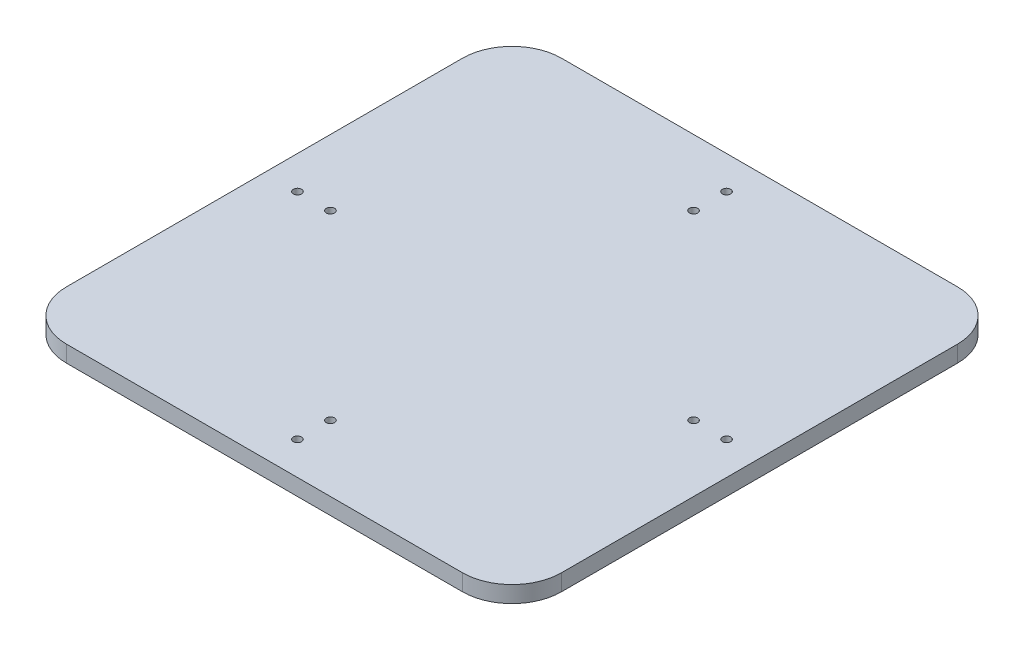
ISO-10303-21;
HEADER;
FILE_DESCRIPTION(('STEP AP214'),'2;1');
FILE_NAME('part.step','',(''),(''),'','','');
FILE_SCHEMA(('AUTOMOTIVE_DESIGN { 1 0 10303 214 1 1 1 1 }'));
ENDSEC;
DATA;
#1=APPLICATION_CONTEXT('core data for automotive mechanical design processes');
#2=APPLICATION_PROTOCOL_DEFINITION('international standard','automotive_design',2000,#1);
#3=PRODUCT_CONTEXT('',#1,'mechanical');
#4=PRODUCT('Part','Part','',(#3));
#5=PRODUCT_RELATED_PRODUCT_CATEGORY('part','',(#4));
#6=PRODUCT_DEFINITION_FORMATION('','',#4);
#7=PRODUCT_DEFINITION_CONTEXT('part definition',#1,'design');
#8=PRODUCT_DEFINITION('design','',#6,#7);
#9=PRODUCT_DEFINITION_SHAPE('','',#8);
#10=(LENGTH_UNIT() NAMED_UNIT(*) SI_UNIT(.MILLI.,.METRE.));
#11=(NAMED_UNIT(*) PLANE_ANGLE_UNIT() SI_UNIT($,.RADIAN.));
#12=(NAMED_UNIT(*) SI_UNIT($,.STERADIAN.) SOLID_ANGLE_UNIT());
#13=UNCERTAINTY_MEASURE_WITH_UNIT(LENGTH_MEASURE(1.E-05),#10,'distance_accuracy_value','');
#14=(GEOMETRIC_REPRESENTATION_CONTEXT(3) GLOBAL_UNCERTAINTY_ASSIGNED_CONTEXT((#13)) GLOBAL_UNIT_ASSIGNED_CONTEXT((#10,
#11,#12)) REPRESENTATION_CONTEXT('',''));
#15=CARTESIAN_POINT('',(0.,0.,0.));
#16=DIRECTION('',(0.,0.,1.));
#17=DIRECTION('',(1.,0.,0.));
#18=AXIS2_PLACEMENT_3D('',#15,#16,#17);
#19=CARTESIAN_POINT('',(120.,14.,120.));
#20=DIRECTION('',(0.,-1.,0.));
#21=DIRECTION('',(0.,0.,-1.));
#22=AXIS2_PLACEMENT_3D('',#19,#20,#21);
#23=CYLINDRICAL_SURFACE('',#22,30.);
#24=CARTESIAN_POINT('',(120.,4.,120.));
#25=DIRECTION('',(0.,1.,0.));
#26=DIRECTION('',(0.,0.,1.));
#27=AXIS2_PLACEMENT_3D('',#24,#25,#26);
#28=CIRCLE('',#27,30.);
#29=CARTESIAN_POINT('',(150.,4.,120.));
#30=VERTEX_POINT('',#29);
#31=CARTESIAN_POINT('',(120.,4.,150.));
#32=VERTEX_POINT('',#31);
#33=EDGE_CURVE('E178',#30,#32,#28,.F.);
#34=ORIENTED_EDGE('',*,*,#33,.F.);
#35=DIRECTION('',(0.,-1.,0.));
#36=VECTOR('',#35,1.);
#37=CARTESIAN_POINT('',(150.,14.,120.));
#38=LINE('',#37,#36);
#39=CARTESIAN_POINT('',(150.,14.,120.));
#40=VERTEX_POINT('',#39);
#41=EDGE_CURVE('E11',#40,#30,#38,.T.);
#42=ORIENTED_EDGE('',*,*,#41,.F.);
#43=CARTESIAN_POINT('',(120.,14.,120.));
#44=DIRECTION('',(0.,1.,0.));
#45=DIRECTION('',(0.,0.,1.));
#46=AXIS2_PLACEMENT_3D('',#43,#44,#45);
#47=CIRCLE('',#46,30.);
#48=CARTESIAN_POINT('',(120.,14.,150.));
#49=VERTEX_POINT('',#48);
#50=EDGE_CURVE('E244',#40,#49,#47,.F.);
#51=ORIENTED_EDGE('',*,*,#50,.T.);
#52=DIRECTION('',(0.,-1.,0.));
#53=VECTOR('',#52,1.);
#54=CARTESIAN_POINT('',(120.,14.,150.));
#55=LINE('',#54,#53);
#56=EDGE_CURVE('E99',#49,#32,#55,.T.);
#57=ORIENTED_EDGE('',*,*,#56,.T.);
#58=EDGE_LOOP('',(#34,#42,#51,#57));
#59=FACE_BOUND('',#58,.T.);
#60=ADVANCED_FACE('F47',(#59),#23,.T.);
#61=CARTESIAN_POINT('',(150.,14.,0.));
#62=DIRECTION('',(1.,0.,0.));
#63=DIRECTION('',(0.,0.,-1.));
#64=AXIS2_PLACEMENT_3D('',#61,#62,#63);
#65=PLANE('',#64);
#66=DIRECTION('',(0.,0.,1.));
#67=VECTOR('',#66,1.);
#68=CARTESIAN_POINT('',(150.,4.,0.));
#69=LINE('',#68,#67);
#70=CARTESIAN_POINT('',(150.,4.,-120.));
#71=VERTEX_POINT('',#70);
#72=EDGE_CURVE('E182',#71,#30,#69,.T.);
#73=ORIENTED_EDGE('',*,*,#72,.F.);
#74=DIRECTION('',(0.,-1.,0.));
#75=VECTOR('',#74,1.);
#76=CARTESIAN_POINT('',(150.,14.,-120.));
#77=LINE('',#76,#75);
#78=CARTESIAN_POINT('',(150.,14.,-120.));
#79=VERTEX_POINT('',#78);
#80=EDGE_CURVE('E57',#79,#71,#77,.T.);
#81=ORIENTED_EDGE('',*,*,#80,.F.);
#82=DIRECTION('',(0.,0.,1.));
#83=VECTOR('',#82,1.);
#84=CARTESIAN_POINT('',(150.,14.,0.));
#85=LINE('',#84,#83);
#86=EDGE_CURVE('E238',#79,#40,#85,.T.);
#87=ORIENTED_EDGE('',*,*,#86,.T.);
#88=ORIENTED_EDGE('',*,*,#41,.T.);
#89=EDGE_LOOP('',(#73,#81,#87,#88));
#90=FACE_BOUND('',#89,.T.);
#91=ADVANCED_FACE('F229',(#90),#65,.T.);
#92=CARTESIAN_POINT('',(120.,14.,-120.));
#93=DIRECTION('',(0.,-1.,0.));
#94=DIRECTION('',(0.,0.,-1.));
#95=AXIS2_PLACEMENT_3D('',#92,#93,#94);
#96=CYLINDRICAL_SURFACE('',#95,30.0000000000001);
#97=CARTESIAN_POINT('',(120.,4.,-120.));
#98=DIRECTION('',(0.,1.,0.));
#99=DIRECTION('',(0.,0.,1.));
#100=AXIS2_PLACEMENT_3D('',#97,#98,#99);
#101=CIRCLE('',#100,30.0000000000001);
#102=CARTESIAN_POINT('',(120.,4.,-150.));
#103=VERTEX_POINT('',#102);
#104=EDGE_CURVE('E186',#103,#71,#101,.F.);
#105=ORIENTED_EDGE('',*,*,#104,.F.);
#106=DIRECTION('',(0.,-1.,0.));
#107=VECTOR('',#106,1.);
#108=CARTESIAN_POINT('',(120.,14.,-150.));
#109=LINE('',#108,#107);
#110=CARTESIAN_POINT('',(120.,14.,-150.));
#111=VERTEX_POINT('',#110);
#112=EDGE_CURVE('E216',#111,#103,#109,.T.);
#113=ORIENTED_EDGE('',*,*,#112,.F.);
#114=CARTESIAN_POINT('',(120.,14.,-120.));
#115=DIRECTION('',(0.,1.,0.));
#116=DIRECTION('',(0.,0.,1.));
#117=AXIS2_PLACEMENT_3D('',#114,#115,#116);
#118=CIRCLE('',#117,30.0000000000001);
#119=EDGE_CURVE('E225',#111,#79,#118,.F.);
#120=ORIENTED_EDGE('',*,*,#119,.T.);
#121=ORIENTED_EDGE('',*,*,#80,.T.);
#122=EDGE_LOOP('',(#105,#113,#120,#121));
#123=FACE_BOUND('',#122,.T.);
#124=ADVANCED_FACE('F223',(#123),#96,.T.);
#125=CARTESIAN_POINT('',(0.,14.,-150.));
#126=DIRECTION('',(0.,0.,-1.));
#127=DIRECTION('',(-1.,0.,0.));
#128=AXIS2_PLACEMENT_3D('',#125,#126,#127);
#129=PLANE('',#128);
#130=DIRECTION('',(1.,0.,0.));
#131=VECTOR('',#130,1.);
#132=CARTESIAN_POINT('',(0.,4.,-150.));
#133=LINE('',#132,#131);
#134=CARTESIAN_POINT('',(-120.,4.,-150.));
#135=VERTEX_POINT('',#134);
#136=EDGE_CURVE('E190',#135,#103,#133,.T.);
#137=ORIENTED_EDGE('',*,*,#136,.F.);
#138=DIRECTION('',(0.,-1.,0.));
#139=VECTOR('',#138,1.);
#140=CARTESIAN_POINT('',(-120.,14.,-150.));
#141=LINE('',#140,#139);
#142=CARTESIAN_POINT('',(-120.,14.,-150.));
#143=VERTEX_POINT('',#142);
#144=EDGE_CURVE('E213',#143,#135,#141,.T.);
#145=ORIENTED_EDGE('',*,*,#144,.F.);
#146=DIRECTION('',(1.,0.,0.));
#147=VECTOR('',#146,1.);
#148=CARTESIAN_POINT('',(0.,14.,-150.));
#149=LINE('',#148,#147);
#150=EDGE_CURVE('E237',#143,#111,#149,.T.);
#151=ORIENTED_EDGE('',*,*,#150,.T.);
#152=ORIENTED_EDGE('',*,*,#112,.T.);
#153=EDGE_LOOP('',(#137,#145,#151,#152));
#154=FACE_BOUND('',#153,.T.);
#155=ADVANCED_FACE('F235',(#154),#129,.T.);
#156=CARTESIAN_POINT('',(-120.,14.,-120.));
#157=DIRECTION('',(0.,-1.,0.));
#158=DIRECTION('',(0.,0.,-1.));
#159=AXIS2_PLACEMENT_3D('',#156,#157,#158);
#160=CYLINDRICAL_SURFACE('',#159,30.0000000000001);
#161=CARTESIAN_POINT('',(-120.,4.,-120.));
#162=DIRECTION('',(0.,1.,0.));
#163=DIRECTION('',(0.,0.,1.));
#164=AXIS2_PLACEMENT_3D('',#161,#162,#163);
#165=CIRCLE('',#164,30.0000000000001);
#166=CARTESIAN_POINT('',(-150.,4.,-120.));
#167=VERTEX_POINT('',#166);
#168=EDGE_CURVE('E194',#167,#135,#165,.F.);
#169=ORIENTED_EDGE('',*,*,#168,.F.);
#170=DIRECTION('',(0.,-1.,0.));
#171=VECTOR('',#170,1.);
#172=CARTESIAN_POINT('',(-150.,14.,-120.));
#173=LINE('',#172,#171);
#174=CARTESIAN_POINT('',(-150.,14.,-120.));
#175=VERTEX_POINT('',#174);
#176=EDGE_CURVE('E137',#175,#167,#173,.T.);
#177=ORIENTED_EDGE('',*,*,#176,.F.);
#178=CARTESIAN_POINT('',(-120.,14.,-120.));
#179=DIRECTION('',(0.,1.,0.));
#180=DIRECTION('',(0.,0.,1.));
#181=AXIS2_PLACEMENT_3D('',#178,#179,#180);
#182=CIRCLE('',#181,30.0000000000001);
#183=EDGE_CURVE('E124',#175,#143,#182,.F.);
#184=ORIENTED_EDGE('',*,*,#183,.T.);
#185=ORIENTED_EDGE('',*,*,#144,.T.);
#186=EDGE_LOOP('',(#169,#177,#184,#185));
#187=FACE_BOUND('',#186,.T.);
#188=ADVANCED_FACE('F249',(#187),#160,.T.);
#189=CARTESIAN_POINT('',(-150.,14.,0.));
#190=DIRECTION('',(1.,0.,0.));
#191=DIRECTION('',(0.,0.,-1.));
#192=AXIS2_PLACEMENT_3D('',#189,#190,#191);
#193=PLANE('',#192);
#194=DIRECTION('',(0.,0.,1.));
#195=VECTOR('',#194,1.);
#196=CARTESIAN_POINT('',(-150.,4.,0.));
#197=LINE('',#196,#195);
#198=CARTESIAN_POINT('',(-150.,4.,120.));
#199=VERTEX_POINT('',#198);
#200=EDGE_CURVE('E132',#167,#199,#197,.T.);
#201=ORIENTED_EDGE('',*,*,#200,.T.);
#202=DIRECTION('',(0.,-1.,0.));
#203=VECTOR('',#202,1.);
#204=CARTESIAN_POINT('',(-150.,14.,120.));
#205=LINE('',#204,#203);
#206=CARTESIAN_POINT('',(-150.,14.,120.));
#207=VERTEX_POINT('',#206);
#208=EDGE_CURVE('E129',#207,#199,#205,.T.);
#209=ORIENTED_EDGE('',*,*,#208,.F.);
#210=DIRECTION('',(0.,0.,1.));
#211=VECTOR('',#210,1.);
#212=CARTESIAN_POINT('',(-150.,14.,0.));
#213=LINE('',#212,#211);
#214=EDGE_CURVE('E117',#175,#207,#213,.T.);
#215=ORIENTED_EDGE('',*,*,#214,.F.);
#216=ORIENTED_EDGE('',*,*,#176,.T.);
#217=EDGE_LOOP('',(#201,#209,#215,#216));
#218=FACE_BOUND('',#217,.T.);
#219=ADVANCED_FACE('F130',(#218),#193,.F.);
#220=CARTESIAN_POINT('',(-120.,14.,120.));
#221=DIRECTION('',(0.,-1.,0.));
#222=DIRECTION('',(0.,0.,-1.));
#223=AXIS2_PLACEMENT_3D('',#220,#221,#222);
#224=CYLINDRICAL_SURFACE('',#223,30.);
#225=CARTESIAN_POINT('',(-120.,4.,120.));
#226=DIRECTION('',(0.,1.,0.));
#227=DIRECTION('',(0.,0.,1.));
#228=AXIS2_PLACEMENT_3D('',#225,#226,#227);
#229=CIRCLE('',#228,30.);
#230=CARTESIAN_POINT('',(-120.,4.,150.));
#231=VERTEX_POINT('',#230);
#232=EDGE_CURVE('E200',#231,#199,#229,.F.);
#233=ORIENTED_EDGE('',*,*,#232,.F.);
#234=DIRECTION('',(0.,-1.,0.));
#235=VECTOR('',#234,1.);
#236=CARTESIAN_POINT('',(-120.,14.,150.));
#237=LINE('',#236,#235);
#238=CARTESIAN_POINT('',(-120.,14.,150.));
#239=VERTEX_POINT('',#238);
#240=EDGE_CURVE('E92',#239,#231,#237,.T.);
#241=ORIENTED_EDGE('',*,*,#240,.F.);
#242=CARTESIAN_POINT('',(-120.,14.,120.));
#243=DIRECTION('',(0.,1.,0.));
#244=DIRECTION('',(0.,0.,1.));
#245=AXIS2_PLACEMENT_3D('',#242,#243,#244);
#246=CIRCLE('',#245,30.);
#247=EDGE_CURVE('E121',#239,#207,#246,.F.);
#248=ORIENTED_EDGE('',*,*,#247,.T.);
#249=ORIENTED_EDGE('',*,*,#208,.T.);
#250=EDGE_LOOP('',(#233,#241,#248,#249));
#251=FACE_BOUND('',#250,.T.);
#252=ADVANCED_FACE('F139',(#251),#224,.T.);
#253=CARTESIAN_POINT('',(0.,14.,-130.));
#254=DIRECTION('',(0.,-1.,0.));
#255=DIRECTION('',(0.,0.,-1.));
#256=AXIS2_PLACEMENT_3D('',#253,#254,#255);
#257=CYLINDRICAL_SURFACE('',#256,2.5);
#258=CARTESIAN_POINT('',(0.,14.,-130.));
#259=DIRECTION('',(0.,1.,0.));
#260=DIRECTION('',(0.,0.,1.));
#261=AXIS2_PLACEMENT_3D('',#258,#259,#260);
#262=CIRCLE('',#261,2.5);
#263=CARTESIAN_POINT('',(0.,14.,-127.5));
#264=VERTEX_POINT('',#263);
#265=EDGE_CURVE('E252',#264,#264,#262,.T.);
#266=ORIENTED_EDGE('',*,*,#265,.T.);
#267=EDGE_LOOP('',(#266));
#268=FACE_BOUND('',#267,.T.);
#269=CARTESIAN_POINT('',(0.,4.,-130.));
#270=DIRECTION('',(0.,1.,0.));
#271=DIRECTION('',(0.,0.,1.));
#272=AXIS2_PLACEMENT_3D('',#269,#270,#271);
#273=CIRCLE('',#272,2.5);
#274=CARTESIAN_POINT('',(0.,4.,-127.5));
#275=VERTEX_POINT('',#274);
#276=EDGE_CURVE('E174',#275,#275,#273,.T.);
#277=ORIENTED_EDGE('',*,*,#276,.F.);
#278=EDGE_LOOP('',(#277));
#279=FACE_BOUND('',#278,.T.);
#280=ADVANCED_FACE('F304',(#268,#279),#257,.F.);
#281=CARTESIAN_POINT('',(0.,14.,-110.));
#282=DIRECTION('',(0.,-1.,0.));
#283=DIRECTION('',(0.,0.,-1.));
#284=AXIS2_PLACEMENT_3D('',#281,#282,#283);
#285=CYLINDRICAL_SURFACE('',#284,2.5);
#286=CARTESIAN_POINT('',(0.,14.,-110.));
#287=DIRECTION('',(0.,1.,0.));
#288=DIRECTION('',(0.,0.,1.));
#289=AXIS2_PLACEMENT_3D('',#286,#287,#288);
#290=CIRCLE('',#289,2.5);
#291=CARTESIAN_POINT('',(0.,14.,-107.5));
#292=VERTEX_POINT('',#291);
#293=EDGE_CURVE('E255',#292,#292,#290,.T.);
#294=ORIENTED_EDGE('',*,*,#293,.T.);
#295=EDGE_LOOP('',(#294));
#296=FACE_BOUND('',#295,.T.);
#297=CARTESIAN_POINT('',(0.,4.,-110.));
#298=DIRECTION('',(0.,1.,0.));
#299=DIRECTION('',(0.,0.,1.));
#300=AXIS2_PLACEMENT_3D('',#297,#298,#299);
#301=CIRCLE('',#300,2.5);
#302=CARTESIAN_POINT('',(0.,4.,-107.5));
#303=VERTEX_POINT('',#302);
#304=EDGE_CURVE('E170',#303,#303,#301,.T.);
#305=ORIENTED_EDGE('',*,*,#304,.F.);
#306=EDGE_LOOP('',(#305));
#307=FACE_BOUND('',#306,.T.);
#308=ADVANCED_FACE('F307',(#296,#307),#285,.F.);
#309=CARTESIAN_POINT('',(0.,14.,110.));
#310=DIRECTION('',(0.,-1.,0.));
#311=DIRECTION('',(0.,0.,-1.));
#312=AXIS2_PLACEMENT_3D('',#309,#310,#311);
#313=CYLINDRICAL_SURFACE('',#312,2.5);
#314=CARTESIAN_POINT('',(0.,14.,110.));
#315=DIRECTION('',(0.,1.,0.));
#316=DIRECTION('',(0.,0.,1.));
#317=AXIS2_PLACEMENT_3D('',#314,#315,#316);
#318=CIRCLE('',#317,2.5);
#319=CARTESIAN_POINT('',(0.,14.,112.5));
#320=VERTEX_POINT('',#319);
#321=EDGE_CURVE('E261',#320,#320,#318,.T.);
#322=ORIENTED_EDGE('',*,*,#321,.T.);
#323=EDGE_LOOP('',(#322));
#324=FACE_BOUND('',#323,.T.);
#325=CARTESIAN_POINT('',(0.,4.,110.));
#326=DIRECTION('',(0.,1.,0.));
#327=DIRECTION('',(0.,0.,1.));
#328=AXIS2_PLACEMENT_3D('',#325,#326,#327);
#329=CIRCLE('',#328,2.5);
#330=CARTESIAN_POINT('',(0.,4.,112.5));
#331=VERTEX_POINT('',#330);
#332=EDGE_CURVE('E166',#331,#331,#329,.T.);
#333=ORIENTED_EDGE('',*,*,#332,.F.);
#334=EDGE_LOOP('',(#333));
#335=FACE_BOUND('',#334,.T.);
#336=ADVANCED_FACE('F328',(#324,#335),#313,.F.);
#337=CARTESIAN_POINT('',(0.,14.,130.));
#338=DIRECTION('',(0.,-1.,0.));
#339=DIRECTION('',(0.,0.,-1.));
#340=AXIS2_PLACEMENT_3D('',#337,#338,#339);
#341=CYLINDRICAL_SURFACE('',#340,2.5);
#342=CARTESIAN_POINT('',(0.,14.,130.));
#343=DIRECTION('',(0.,1.,0.));
#344=DIRECTION('',(0.,0.,1.));
#345=AXIS2_PLACEMENT_3D('',#342,#343,#344);
#346=CIRCLE('',#345,2.5);
#347=CARTESIAN_POINT('',(0.,14.,132.5));
#348=VERTEX_POINT('',#347);
#349=EDGE_CURVE('E265',#348,#348,#346,.T.);
#350=ORIENTED_EDGE('',*,*,#349,.T.);
#351=EDGE_LOOP('',(#350));
#352=FACE_BOUND('',#351,.T.);
#353=CARTESIAN_POINT('',(0.,4.,130.));
#354=DIRECTION('',(0.,1.,0.));
#355=DIRECTION('',(0.,0.,1.));
#356=AXIS2_PLACEMENT_3D('',#353,#354,#355);
#357=CIRCLE('',#356,2.5);
#358=CARTESIAN_POINT('',(0.,4.,132.5));
#359=VERTEX_POINT('',#358);
#360=EDGE_CURVE('E162',#359,#359,#357,.T.);
#361=ORIENTED_EDGE('',*,*,#360,.F.);
#362=EDGE_LOOP('',(#361));
#363=FACE_BOUND('',#362,.T.);
#364=ADVANCED_FACE('F332',(#352,#363),#341,.F.);
#365=CARTESIAN_POINT('',(110.,14.,0.));
#366=DIRECTION('',(0.,-1.,0.));
#367=DIRECTION('',(0.,0.,-1.));
#368=AXIS2_PLACEMENT_3D('',#365,#366,#367);
#369=CYLINDRICAL_SURFACE('',#368,2.49999999999999);
#370=CARTESIAN_POINT('',(110.,14.,0.));
#371=DIRECTION('',(0.,1.,0.));
#372=DIRECTION('',(0.,0.,1.));
#373=AXIS2_PLACEMENT_3D('',#370,#371,#372);
#374=CIRCLE('',#373,2.49999999999999);
#375=CARTESIAN_POINT('',(110.,14.,2.49999999999999));
#376=VERTEX_POINT('',#375);
#377=EDGE_CURVE('E269',#376,#376,#374,.T.);
#378=ORIENTED_EDGE('',*,*,#377,.T.);
#379=EDGE_LOOP('',(#378));
#380=FACE_BOUND('',#379,.T.);
#381=CARTESIAN_POINT('',(110.,4.,0.));
#382=DIRECTION('',(0.,1.,0.));
#383=DIRECTION('',(0.,0.,1.));
#384=AXIS2_PLACEMENT_3D('',#381,#382,#383);
#385=CIRCLE('',#384,2.49999999999999);
#386=CARTESIAN_POINT('',(110.,4.,2.49999999999999));
#387=VERTEX_POINT('',#386);
#388=EDGE_CURVE('E158',#387,#387,#385,.T.);
#389=ORIENTED_EDGE('',*,*,#388,.F.);
#390=EDGE_LOOP('',(#389));
#391=FACE_BOUND('',#390,.T.);
#392=ADVANCED_FACE('F336',(#380,#391),#369,.F.);
#393=CARTESIAN_POINT('',(130.,14.,0.));
#394=DIRECTION('',(0.,-1.,0.));
#395=DIRECTION('',(0.,0.,-1.));
#396=AXIS2_PLACEMENT_3D('',#393,#394,#395);
#397=CYLINDRICAL_SURFACE('',#396,2.5);
#398=CARTESIAN_POINT('',(130.,14.,0.));
#399=DIRECTION('',(0.,1.,0.));
#400=DIRECTION('',(0.,0.,1.));
#401=AXIS2_PLACEMENT_3D('',#398,#399,#400);
#402=CIRCLE('',#401,2.5);
#403=CARTESIAN_POINT('',(130.,14.,2.5));
#404=VERTEX_POINT('',#403);
#405=EDGE_CURVE('E273',#404,#404,#402,.T.);
#406=ORIENTED_EDGE('',*,*,#405,.T.);
#407=EDGE_LOOP('',(#406));
#408=FACE_BOUND('',#407,.T.);
#409=CARTESIAN_POINT('',(130.,4.,0.));
#410=DIRECTION('',(0.,1.,0.));
#411=DIRECTION('',(0.,0.,1.));
#412=AXIS2_PLACEMENT_3D('',#409,#410,#411);
#413=CIRCLE('',#412,2.5);
#414=CARTESIAN_POINT('',(130.,4.,2.5));
#415=VERTEX_POINT('',#414);
#416=EDGE_CURVE('E154',#415,#415,#413,.T.);
#417=ORIENTED_EDGE('',*,*,#416,.F.);
#418=EDGE_LOOP('',(#417));
#419=FACE_BOUND('',#418,.T.);
#420=ADVANCED_FACE('F340',(#408,#419),#397,.F.);
#421=CARTESIAN_POINT('',(-130.,14.,0.));
#422=DIRECTION('',(0.,-1.,0.));
#423=DIRECTION('',(0.,0.,-1.));
#424=AXIS2_PLACEMENT_3D('',#421,#422,#423);
#425=CYLINDRICAL_SURFACE('',#424,2.5);
#426=CARTESIAN_POINT('',(-130.,14.,0.));
#427=DIRECTION('',(0.,1.,0.));
#428=DIRECTION('',(0.,0.,1.));
#429=AXIS2_PLACEMENT_3D('',#426,#427,#428);
#430=CIRCLE('',#429,2.5);
#431=CARTESIAN_POINT('',(-130.,14.,2.50000000000001));
#432=VERTEX_POINT('',#431);
#433=EDGE_CURVE('E277',#432,#432,#430,.T.);
#434=ORIENTED_EDGE('',*,*,#433,.T.);
#435=EDGE_LOOP('',(#434));
#436=FACE_BOUND('',#435,.T.);
#437=CARTESIAN_POINT('',(-130.,4.,0.));
#438=DIRECTION('',(0.,1.,0.));
#439=DIRECTION('',(0.,0.,1.));
#440=AXIS2_PLACEMENT_3D('',#437,#438,#439);
#441=CIRCLE('',#440,2.5);
#442=CARTESIAN_POINT('',(-130.,4.,2.50000000000001));
#443=VERTEX_POINT('',#442);
#444=EDGE_CURVE('E150',#443,#443,#441,.T.);
#445=ORIENTED_EDGE('',*,*,#444,.F.);
#446=EDGE_LOOP('',(#445));
#447=FACE_BOUND('',#446,.T.);
#448=ADVANCED_FACE('F343',(#436,#447),#425,.F.);
#449=CARTESIAN_POINT('',(-110.,14.,0.));
#450=DIRECTION('',(0.,-1.,0.));
#451=DIRECTION('',(0.,0.,-1.));
#452=AXIS2_PLACEMENT_3D('',#449,#450,#451);
#453=CYLINDRICAL_SURFACE('',#452,2.49999999999999);
#454=CARTESIAN_POINT('',(-110.,14.,0.));
#455=DIRECTION('',(0.,1.,0.));
#456=DIRECTION('',(0.,0.,1.));
#457=AXIS2_PLACEMENT_3D('',#454,#455,#456);
#458=CIRCLE('',#457,2.49999999999999);
#459=CARTESIAN_POINT('',(-110.,14.,2.50000000000001));
#460=VERTEX_POINT('',#459);
#461=EDGE_CURVE('E206',#460,#460,#458,.T.);
#462=ORIENTED_EDGE('',*,*,#461,.T.);
#463=EDGE_LOOP('',(#462));
#464=FACE_BOUND('',#463,.T.);
#465=CARTESIAN_POINT('',(-110.,4.,0.));
#466=DIRECTION('',(0.,1.,0.));
#467=DIRECTION('',(0.,0.,1.));
#468=AXIS2_PLACEMENT_3D('',#465,#466,#467);
#469=CIRCLE('',#468,2.49999999999999);
#470=CARTESIAN_POINT('',(-110.,4.,2.50000000000001));
#471=VERTEX_POINT('',#470);
#472=EDGE_CURVE('E146',#471,#471,#469,.T.);
#473=ORIENTED_EDGE('',*,*,#472,.F.);
#474=EDGE_LOOP('',(#473));
#475=FACE_BOUND('',#474,.T.);
#476=ADVANCED_FACE('F49',(#464,#475),#453,.F.);
#477=CARTESIAN_POINT('',(0.,14.,150.));
#478=DIRECTION('',(0.,0.,-1.));
#479=DIRECTION('',(-1.,0.,0.));
#480=AXIS2_PLACEMENT_3D('',#477,#478,#479);
#481=PLANE('',#480);
#482=DIRECTION('',(1.,0.,0.));
#483=VECTOR('',#482,1.);
#484=CARTESIAN_POINT('',(0.,4.,150.));
#485=LINE('',#484,#483);
#486=EDGE_CURVE('E203',#231,#32,#485,.T.);
#487=ORIENTED_EDGE('',*,*,#486,.T.);
#488=ORIENTED_EDGE('',*,*,#56,.F.);
#489=DIRECTION('',(1.,0.,0.));
#490=VECTOR('',#489,1.);
#491=CARTESIAN_POINT('',(0.,14.,150.));
#492=LINE('',#491,#490);
#493=EDGE_CURVE('E65',#239,#49,#492,.T.);
#494=ORIENTED_EDGE('',*,*,#493,.F.);
#495=ORIENTED_EDGE('',*,*,#240,.T.);
#496=EDGE_LOOP('',(#487,#488,#494,#495));
#497=FACE_BOUND('',#496,.T.);
#498=ADVANCED_FACE('F250',(#497),#481,.F.);
#499=CARTESIAN_POINT('',(0.,14.,0.));
#500=DIRECTION('',(0.,1.,0.));
#501=DIRECTION('',(0.,0.,1.));
#502=AXIS2_PLACEMENT_3D('',#499,#500,#501);
#503=PLANE('',#502);
#504=ORIENTED_EDGE('',*,*,#461,.F.);
#505=EDGE_LOOP('',(#504));
#506=FACE_BOUND('',#505,.T.);
#507=ORIENTED_EDGE('',*,*,#433,.F.);
#508=EDGE_LOOP('',(#507));
#509=FACE_BOUND('',#508,.T.);
#510=ORIENTED_EDGE('',*,*,#405,.F.);
#511=EDGE_LOOP('',(#510));
#512=FACE_BOUND('',#511,.T.);
#513=ORIENTED_EDGE('',*,*,#377,.F.);
#514=EDGE_LOOP('',(#513));
#515=FACE_BOUND('',#514,.T.);
#516=ORIENTED_EDGE('',*,*,#349,.F.);
#517=EDGE_LOOP('',(#516));
#518=FACE_BOUND('',#517,.T.);
#519=ORIENTED_EDGE('',*,*,#321,.F.);
#520=EDGE_LOOP('',(#519));
#521=FACE_BOUND('',#520,.T.);
#522=ORIENTED_EDGE('',*,*,#293,.F.);
#523=EDGE_LOOP('',(#522));
#524=FACE_BOUND('',#523,.T.);
#525=ORIENTED_EDGE('',*,*,#265,.F.);
#526=EDGE_LOOP('',(#525));
#527=FACE_BOUND('',#526,.T.);
#528=ORIENTED_EDGE('',*,*,#50,.F.);
#529=ORIENTED_EDGE('',*,*,#86,.F.);
#530=ORIENTED_EDGE('',*,*,#119,.F.);
#531=ORIENTED_EDGE('',*,*,#150,.F.);
#532=ORIENTED_EDGE('',*,*,#183,.F.);
#533=ORIENTED_EDGE('',*,*,#214,.T.);
#534=ORIENTED_EDGE('',*,*,#247,.F.);
#535=ORIENTED_EDGE('',*,*,#493,.T.);
#536=EDGE_LOOP('',(#528,#529,#530,#531,#532,#533,#534,#535));
#537=FACE_BOUND('',#536,.T.);
#538=ADVANCED_FACE('F119',(#506,#509,#512,#515,#518,#521,#524,#527,#537),#503,.T.);
#539=CARTESIAN_POINT('',(0.,4.,0.));
#540=DIRECTION('',(0.,1.,0.));
#541=DIRECTION('',(0.,0.,1.));
#542=AXIS2_PLACEMENT_3D('',#539,#540,#541);
#543=PLANE('',#542);
#544=ORIENTED_EDGE('',*,*,#472,.T.);
#545=EDGE_LOOP('',(#544));
#546=FACE_BOUND('',#545,.T.);
#547=ORIENTED_EDGE('',*,*,#444,.T.);
#548=EDGE_LOOP('',(#547));
#549=FACE_BOUND('',#548,.T.);
#550=ORIENTED_EDGE('',*,*,#416,.T.);
#551=EDGE_LOOP('',(#550));
#552=FACE_BOUND('',#551,.T.);
#553=ORIENTED_EDGE('',*,*,#388,.T.);
#554=EDGE_LOOP('',(#553));
#555=FACE_BOUND('',#554,.T.);
#556=ORIENTED_EDGE('',*,*,#360,.T.);
#557=EDGE_LOOP('',(#556));
#558=FACE_BOUND('',#557,.T.);
#559=ORIENTED_EDGE('',*,*,#332,.T.);
#560=EDGE_LOOP('',(#559));
#561=FACE_BOUND('',#560,.T.);
#562=ORIENTED_EDGE('',*,*,#304,.T.);
#563=EDGE_LOOP('',(#562));
#564=FACE_BOUND('',#563,.T.);
#565=ORIENTED_EDGE('',*,*,#276,.T.);
#566=EDGE_LOOP('',(#565));
#567=FACE_BOUND('',#566,.T.);
#568=ORIENTED_EDGE('',*,*,#33,.T.);
#569=ORIENTED_EDGE('',*,*,#486,.F.);
#570=ORIENTED_EDGE('',*,*,#232,.T.);
#571=ORIENTED_EDGE('',*,*,#200,.F.);
#572=ORIENTED_EDGE('',*,*,#168,.T.);
#573=ORIENTED_EDGE('',*,*,#136,.T.);
#574=ORIENTED_EDGE('',*,*,#104,.T.);
#575=ORIENTED_EDGE('',*,*,#72,.T.);
#576=EDGE_LOOP('',(#568,#569,#570,#571,#572,#573,#574,#575));
#577=FACE_BOUND('',#576,.T.);
#578=ADVANCED_FACE('F231',(#546,#549,#552,#555,#558,#561,#564,#567,#577),#543,.F.);
#579=CLOSED_SHELL('',(#60,#91,#124,#155,#188,#219,#252,#280,#308,#336,#364,#392,#420,#448,#476,
#498,#538,#578));
#580=MANIFOLD_SOLID_BREP('B2',#579);
#581=ADVANCED_BREP_SHAPE_REPRESENTATION('',(#18,#580),#14);
#582=SHAPE_DEFINITION_REPRESENTATION(#9,#581);
ENDSEC;
END-ISO-10303-21;
